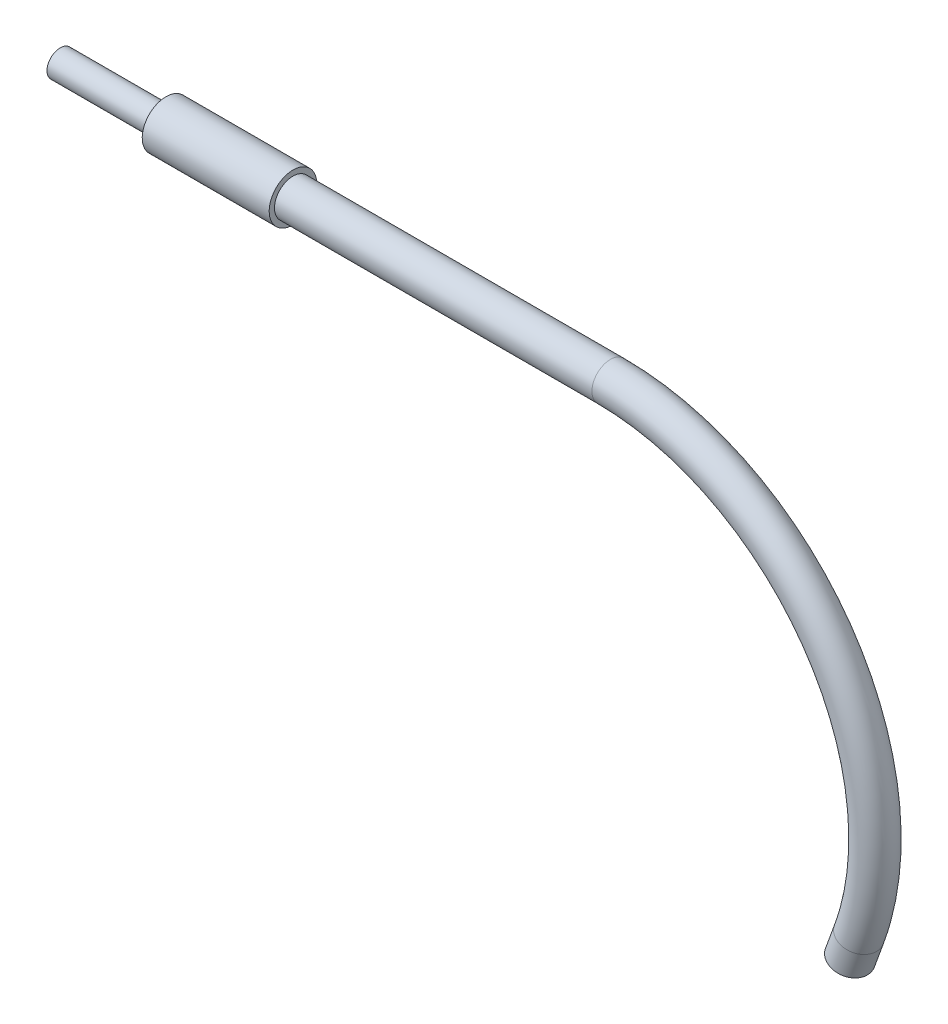
ISO-10303-21;
HEADER;
FILE_DESCRIPTION(('STEP AP214'),'2;1');
FILE_NAME('part.step','',(''),(''),'','','');
FILE_SCHEMA(('AUTOMOTIVE_DESIGN { 1 0 10303 214 1 1 1 1 }'));
ENDSEC;
DATA;
#1=APPLICATION_CONTEXT('core data for automotive mechanical design processes');
#2=APPLICATION_PROTOCOL_DEFINITION('international standard','automotive_design',2000,#1);
#3=PRODUCT_CONTEXT('',#1,'mechanical');
#4=PRODUCT('Part','Part','',(#3));
#5=PRODUCT_RELATED_PRODUCT_CATEGORY('part','',(#4));
#6=PRODUCT_DEFINITION_FORMATION('','',#4);
#7=PRODUCT_DEFINITION_CONTEXT('part definition',#1,'design');
#8=PRODUCT_DEFINITION('design','',#6,#7);
#9=PRODUCT_DEFINITION_SHAPE('','',#8);
#10=(LENGTH_UNIT() NAMED_UNIT(*) SI_UNIT(.MILLI.,.METRE.));
#11=(NAMED_UNIT(*) PLANE_ANGLE_UNIT() SI_UNIT($,.RADIAN.));
#12=(NAMED_UNIT(*) SI_UNIT($,.STERADIAN.) SOLID_ANGLE_UNIT());
#13=UNCERTAINTY_MEASURE_WITH_UNIT(LENGTH_MEASURE(1.E-05),#10,'distance_accuracy_value','');
#14=(GEOMETRIC_REPRESENTATION_CONTEXT(3) GLOBAL_UNCERTAINTY_ASSIGNED_CONTEXT((#13)) GLOBAL_UNIT_ASSIGNED_CONTEXT((#10,
#11,#12)) REPRESENTATION_CONTEXT('',''));
#15=CARTESIAN_POINT('',(0.,0.,0.));
#16=DIRECTION('',(0.,0.,1.));
#17=DIRECTION('',(1.,0.,0.));
#18=AXIS2_PLACEMENT_3D('',#15,#16,#17);
#19=CARTESIAN_POINT('',(0.250000000000014,0.,0.));
#20=DIRECTION('',(-1.,0.,0.));
#21=DIRECTION('',(0.,-1.,0.));
#22=AXIS2_PLACEMENT_3D('',#19,#20,#21);
#23=PLANE('',#22);
#24=CARTESIAN_POINT('',(0.250000000000014,0.,0.));
#25=DIRECTION('',(-1.,0.,0.));
#26=DIRECTION('',(0.,-1.,0.));
#27=AXIS2_PLACEMENT_3D('',#24,#25,#26);
#28=CIRCLE('',#27,1.5);
#29=CARTESIAN_POINT('',(0.250000000000014,-1.5,0.));
#30=VERTEX_POINT('',#29);
#31=EDGE_CURVE('E17',#30,#30,#28,.T.);
#32=ORIENTED_EDGE('',*,*,#31,.T.);
#33=EDGE_LOOP('',(#32));
#34=FACE_BOUND('',#33,.T.);
#35=ADVANCED_FACE('F14',(#34),#23,.T.);
#36=CARTESIAN_POINT('',(0.250000000000014,0.,0.));
#37=DIRECTION('',(-1.,0.,0.));
#38=DIRECTION('',(0.,-1.,0.));
#39=AXIS2_PLACEMENT_3D('',#36,#37,#38);
#40=CYLINDRICAL_SURFACE('',#39,1.5);
#41=ORIENTED_EDGE('',*,*,#31,.F.);
#42=EDGE_LOOP('',(#41));
#43=FACE_BOUND('',#42,.T.);
#44=CARTESIAN_POINT('',(0.,0.,0.));
#45=DIRECTION('',(-1.,0.,0.));
#46=DIRECTION('',(0.,-1.,0.));
#47=AXIS2_PLACEMENT_3D('',#44,#45,#46);
#48=CIRCLE('',#47,1.5);
#49=CARTESIAN_POINT('',(0.,-1.5,0.));
#50=VERTEX_POINT('',#49);
#51=EDGE_CURVE('E47',#50,#50,#48,.T.);
#52=ORIENTED_EDGE('',*,*,#51,.T.);
#53=EDGE_LOOP('',(#52));
#54=FACE_BOUND('',#53,.T.);
#55=ADVANCED_FACE('F55',(#43,#54),#40,.F.);
#56=CARTESIAN_POINT('',(0.,0.,0.));
#57=DIRECTION('',(1.,0.,0.));
#58=DIRECTION('',(0.,1.,0.));
#59=AXIS2_PLACEMENT_3D('',#56,#57,#58);
#60=PLANE('',#59);
#61=CARTESIAN_POINT('',(0.,0.,0.));
#62=DIRECTION('',(-1.,0.,0.));
#63=DIRECTION('',(0.,-1.,0.));
#64=AXIS2_PLACEMENT_3D('',#61,#62,#63);
#65=CIRCLE('',#64,2.5);
#66=CARTESIAN_POINT('',(0.,-2.5,0.));
#67=VERTEX_POINT('',#66);
#68=EDGE_CURVE('E45',#67,#67,#65,.F.);
#69=ORIENTED_EDGE('',*,*,#68,.F.);
#70=EDGE_LOOP('',(#69));
#71=FACE_BOUND('',#70,.T.);
#72=ORIENTED_EDGE('',*,*,#51,.F.);
#73=EDGE_LOOP('',(#72));
#74=FACE_BOUND('',#73,.T.);
#75=ADVANCED_FACE('F57',(#71,#74),#60,.F.);
#76=CARTESIAN_POINT('',(0.,0.,0.));
#77=DIRECTION('',(-1.,0.,0.));
#78=DIRECTION('',(0.,-1.,0.));
#79=AXIS2_PLACEMENT_3D('',#76,#77,#78);
#80=CYLINDRICAL_SURFACE('',#79,2.5);
#81=ORIENTED_EDGE('',*,*,#68,.T.);
#82=EDGE_LOOP('',(#81));
#83=FACE_BOUND('',#82,.T.);
#84=CARTESIAN_POINT('',(20.0000000000001,0.,0.));
#85=DIRECTION('',(-1.,0.,0.));
#86=DIRECTION('',(0.,-1.,0.));
#87=AXIS2_PLACEMENT_3D('',#84,#85,#86);
#88=CIRCLE('',#87,2.5);
#89=CARTESIAN_POINT('',(20.0000000000001,-2.5,0.));
#90=VERTEX_POINT('',#89);
#91=EDGE_CURVE('E42',#90,#90,#88,.T.);
#92=ORIENTED_EDGE('',*,*,#91,.T.);
#93=EDGE_LOOP('',(#92));
#94=FACE_BOUND('',#93,.T.);
#95=ADVANCED_FACE('F64',(#83,#94),#80,.T.);
#96=CARTESIAN_POINT('',(20.0000000000001,2.5,0.));
#97=DIRECTION('',(1.,0.,0.));
#98=DIRECTION('',(0.,1.,0.));
#99=AXIS2_PLACEMENT_3D('',#96,#97,#98);
#100=PLANE('',#99);
#101=CARTESIAN_POINT('',(20.0000000000001,0.,0.));
#102=DIRECTION('',(-1.,0.,0.));
#103=DIRECTION('',(0.,-1.,0.));
#104=AXIS2_PLACEMENT_3D('',#101,#102,#103);
#105=CIRCLE('',#104,4.5);
#106=CARTESIAN_POINT('',(20.0000000000001,-4.5,0.));
#107=VERTEX_POINT('',#106);
#108=EDGE_CURVE('E39',#107,#107,#105,.F.);
#109=ORIENTED_EDGE('',*,*,#108,.F.);
#110=EDGE_LOOP('',(#109));
#111=FACE_BOUND('',#110,.T.);
#112=ORIENTED_EDGE('',*,*,#91,.F.);
#113=EDGE_LOOP('',(#112));
#114=FACE_BOUND('',#113,.T.);
#115=ADVANCED_FACE('F93',(#111,#114),#100,.F.);
#116=CARTESIAN_POINT('',(0.,0.,0.));
#117=DIRECTION('',(-1.,0.,0.));
#118=DIRECTION('',(0.,-1.,0.));
#119=AXIS2_PLACEMENT_3D('',#116,#117,#118);
#120=CYLINDRICAL_SURFACE('',#119,4.5);
#121=ORIENTED_EDGE('',*,*,#108,.T.);
#122=EDGE_LOOP('',(#121));
#123=FACE_BOUND('',#122,.T.);
#124=CARTESIAN_POINT('',(44.0000000000001,0.,0.));
#125=DIRECTION('',(-1.,0.,0.));
#126=DIRECTION('',(0.,-1.,0.));
#127=AXIS2_PLACEMENT_3D('',#124,#125,#126);
#128=CIRCLE('',#127,4.5);
#129=CARTESIAN_POINT('',(44.0000000000001,-4.49999999999999,0.));
#130=VERTEX_POINT('',#129);
#131=EDGE_CURVE('E36',#130,#130,#128,.T.);
#132=ORIENTED_EDGE('',*,*,#131,.T.);
#133=EDGE_LOOP('',(#132));
#134=FACE_BOUND('',#133,.T.);
#135=ADVANCED_FACE('F89',(#123,#134),#120,.T.);
#136=CARTESIAN_POINT('',(44.0000000000001,4.50000000000002,0.));
#137=DIRECTION('',(-1.,0.,0.));
#138=DIRECTION('',(0.,-1.,0.));
#139=AXIS2_PLACEMENT_3D('',#136,#137,#138);
#140=PLANE('',#139);
#141=CARTESIAN_POINT('',(44.0000000000001,0.,0.));
#142=DIRECTION('',(-1.,0.,0.));
#143=DIRECTION('',(0.,-1.,0.));
#144=AXIS2_PLACEMENT_3D('',#141,#142,#143);
#145=CIRCLE('',#144,3.5);
#146=CARTESIAN_POINT('',(44.0000000000001,-3.50000000000001,0.));
#147=VERTEX_POINT('',#146);
#148=EDGE_CURVE('E33',#147,#147,#145,.F.);
#149=ORIENTED_EDGE('',*,*,#148,.F.);
#150=EDGE_LOOP('',(#149));
#151=FACE_BOUND('',#150,.T.);
#152=ORIENTED_EDGE('',*,*,#131,.F.);
#153=EDGE_LOOP('',(#152));
#154=FACE_BOUND('',#153,.T.);
#155=ADVANCED_FACE('F85',(#151,#154),#140,.F.);
#156=CARTESIAN_POINT('',(149.274530322667,-71.7994702702131,0.));
#157=DIRECTION('',(-0.342020143325673,-0.939692620785907,0.));
#158=DIRECTION('',(0.939692620785907,-0.342020143325673,0.));
#159=AXIS2_PLACEMENT_3D('',#156,#157,#158);
#160=PLANE('',#159);
#161=CARTESIAN_POINT('',(149.274530322667,-71.7994702702132,0.));
#162=DIRECTION('',(-0.342020143325673,-0.939692620785907,0.));
#163=DIRECTION('',(0.939692620785907,-0.342020143325673,0.));
#164=AXIS2_PLACEMENT_3D('',#161,#162,#163);
#165=CIRCLE('',#164,3.5);
#166=CARTESIAN_POINT('',(152.563454495418,-72.996540771853,0.));
#167=VERTEX_POINT('',#166);
#168=EDGE_CURVE('E26',#167,#167,#165,.F.);
#169=ORIENTED_EDGE('',*,*,#168,.F.);
#170=EDGE_LOOP('',(#169));
#171=FACE_BOUND('',#170,.T.);
#172=ADVANCED_FACE('F81',(#171),#160,.T.);
#173=CARTESIAN_POINT('',(104.,0.,0.));
#174=DIRECTION('',(-1.,0.,0.));
#175=DIRECTION('',(0.,-1.,0.));
#176=AXIS2_PLACEMENT_3D('',#173,#174,#175);
#177=CYLINDRICAL_SURFACE('',#176,3.5);
#178=CARTESIAN_POINT('',(104.,0.,0.));
#179=DIRECTION('',(1.,0.,0.));
#180=DIRECTION('',(0.,1.,0.));
#181=AXIS2_PLACEMENT_3D('',#178,#179,#180);
#182=CIRCLE('',#181,3.5);
#183=CARTESIAN_POINT('',(104.,3.49999999999995,0.));
#184=VERTEX_POINT('',#183);
#185=EDGE_CURVE('E21',#184,#184,#182,.T.);
#186=ORIENTED_EDGE('',*,*,#185,.F.);
#187=EDGE_LOOP('',(#186));
#188=FACE_BOUND('',#187,.T.);
#189=ORIENTED_EDGE('',*,*,#148,.T.);
#190=EDGE_LOOP('',(#189));
#191=FACE_BOUND('',#190,.T.);
#192=ADVANCED_FACE('F75',(#188,#191),#177,.T.);
#193=CARTESIAN_POINT('',(150.984631039296,-67.1010071662836,0.));
#194=DIRECTION('',(-0.342020143325673,-0.939692620785907,0.));
#195=DIRECTION('',(0.939692620785907,-0.342020143325673,0.));
#196=AXIS2_PLACEMENT_3D('',#193,#194,#195);
#197=CYLINDRICAL_SURFACE('',#196,3.5);
#198=ORIENTED_EDGE('',*,*,#168,.T.);
#199=EDGE_LOOP('',(#198));
#200=FACE_BOUND('',#199,.T.);
#201=CARTESIAN_POINT('',(150.984631039296,-67.1010071662836,0.));
#202=DIRECTION('',(-0.34202014332567,-0.939692620785908,0.));
#203=DIRECTION('',(0.939692620785908,-0.34202014332567,0.));
#204=AXIS2_PLACEMENT_3D('',#201,#202,#203);
#205=CIRCLE('',#204,3.5);
#206=CARTESIAN_POINT('',(154.273555212046,-68.2980776679234,0.));
#207=VERTEX_POINT('',#206);
#208=EDGE_CURVE('E10',#207,#207,#205,.F.);
#209=ORIENTED_EDGE('',*,*,#208,.F.);
#210=EDGE_LOOP('',(#209));
#211=FACE_BOUND('',#210,.T.);
#212=ADVANCED_FACE('F69',(#200,#211),#197,.T.);
#213=CARTESIAN_POINT('',(104.,-50.,0.));
#214=DIRECTION('',(0.,0.,-1.));
#215=DIRECTION('',(-1.,0.,0.));
#216=AXIS2_PLACEMENT_3D('',#213,#214,#215);
#217=TOROIDAL_SURFACE('',#216,50.,3.5);
#218=ORIENTED_EDGE('',*,*,#185,.T.);
#219=EDGE_LOOP('',(#218));
#220=FACE_BOUND('',#219,.T.);
#221=ORIENTED_EDGE('',*,*,#208,.T.);
#222=EDGE_LOOP('',(#221));
#223=FACE_BOUND('',#222,.T.);
#224=ADVANCED_FACE('F67',(#220,#223),#217,.T.);
#225=CLOSED_SHELL('',(#35,#55,#75,#95,#115,#135,#155,#172,#192,#212,#224));
#226=MANIFOLD_SOLID_BREP('B1',#225);
#227=ADVANCED_BREP_SHAPE_REPRESENTATION('',(#18,#226),#14);
#228=SHAPE_DEFINITION_REPRESENTATION(#9,#227);
ENDSEC;
END-ISO-10303-21;
